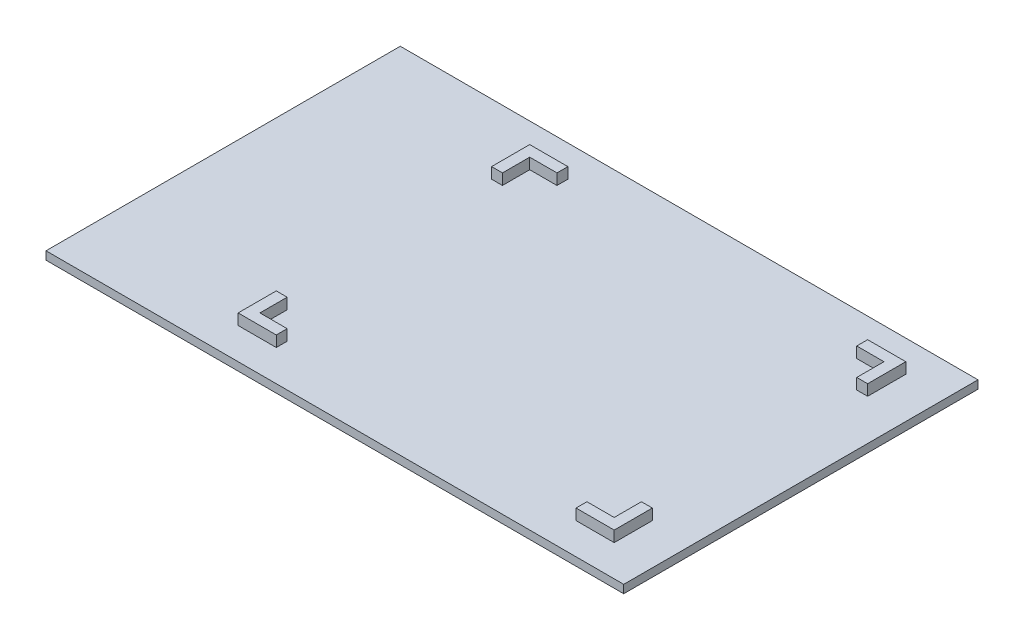
ISO-10303-21;
HEADER;
FILE_DESCRIPTION(('STEP AP214'),'2;1');
FILE_NAME('part.step','',(''),(''),'','','');
FILE_SCHEMA(('AUTOMOTIVE_DESIGN { 1 0 10303 214 1 1 1 1 }'));
ENDSEC;
DATA;
#1=APPLICATION_CONTEXT('core data for automotive mechanical design processes');
#2=APPLICATION_PROTOCOL_DEFINITION('international standard','automotive_design',2000,#1);
#3=PRODUCT_CONTEXT('',#1,'mechanical');
#4=PRODUCT('Part','Part','',(#3));
#5=PRODUCT_RELATED_PRODUCT_CATEGORY('part','',(#4));
#6=PRODUCT_DEFINITION_FORMATION('','',#4);
#7=PRODUCT_DEFINITION_CONTEXT('part definition',#1,'design');
#8=PRODUCT_DEFINITION('design','',#6,#7);
#9=PRODUCT_DEFINITION_SHAPE('','',#8);
#10=(LENGTH_UNIT() NAMED_UNIT(*) SI_UNIT(.MILLI.,.METRE.));
#11=(NAMED_UNIT(*) PLANE_ANGLE_UNIT() SI_UNIT($,.RADIAN.));
#12=(NAMED_UNIT(*) SI_UNIT($,.STERADIAN.) SOLID_ANGLE_UNIT());
#13=UNCERTAINTY_MEASURE_WITH_UNIT(LENGTH_MEASURE(1.E-05),#10,'distance_accuracy_value','');
#14=(GEOMETRIC_REPRESENTATION_CONTEXT(3) GLOBAL_UNCERTAINTY_ASSIGNED_CONTEXT((#13)) GLOBAL_UNIT_ASSIGNED_CONTEXT((#10,
#11,#12)) REPRESENTATION_CONTEXT('',''));
#15=CARTESIAN_POINT('',(0.,0.,0.));
#16=DIRECTION('',(0.,0.,1.));
#17=DIRECTION('',(1.,0.,0.));
#18=AXIS2_PLACEMENT_3D('',#15,#16,#17);
#19=CARTESIAN_POINT('',(0.,3.,0.));
#20=DIRECTION('',(0.,1.,0.));
#21=DIRECTION('',(0.,0.,1.));
#22=AXIS2_PLACEMENT_3D('',#19,#20,#21);
#23=PLANE('',#22);
#24=DIRECTION('',(-1.,0.,0.));
#25=VECTOR('',#24,1.);
#26=CARTESIAN_POINT('',(106.,3.,-65.));
#27=LINE('',#26,#25);
#28=CARTESIAN_POINT('',(106.,3.,-65.));
#29=VERTEX_POINT('',#28);
#30=CARTESIAN_POINT('',(-106.,3.,-65.));
#31=VERTEX_POINT('',#30);
#32=EDGE_CURVE('E466',#29,#31,#27,.T.);
#33=ORIENTED_EDGE('',*,*,#32,.T.);
#34=DIRECTION('',(0.,0.,1.));
#35=VECTOR('',#34,1.);
#36=CARTESIAN_POINT('',(-106.,3.,-65.));
#37=LINE('',#36,#35);
#38=CARTESIAN_POINT('',(-106.,3.,65.));
#39=VERTEX_POINT('',#38);
#40=EDGE_CURVE('E470',#31,#39,#37,.T.);
#41=ORIENTED_EDGE('',*,*,#40,.T.);
#42=DIRECTION('',(1.,0.,0.));
#43=VECTOR('',#42,1.);
#44=CARTESIAN_POINT('',(-106.,3.,65.));
#45=LINE('',#44,#43);
#46=CARTESIAN_POINT('',(106.,3.,65.));
#47=VERTEX_POINT('',#46);
#48=EDGE_CURVE('E474',#39,#47,#45,.T.);
#49=ORIENTED_EDGE('',*,*,#48,.T.);
#50=DIRECTION('',(0.,0.,-1.));
#51=VECTOR('',#50,1.);
#52=CARTESIAN_POINT('',(106.,3.,65.));
#53=LINE('',#52,#51);
#54=EDGE_CURVE('E477',#47,#29,#53,.T.);
#55=ORIENTED_EDGE('',*,*,#54,.T.);
#56=EDGE_LOOP('',(#33,#41,#49,#55));
#57=FACE_BOUND('',#56,.T.);
#58=DIRECTION('',(-1.,0.,0.));
#59=VECTOR('',#58,1.);
#60=CARTESIAN_POINT('',(91.,3.,-53.5));
#61=LINE('',#60,#59);
#62=CARTESIAN_POINT('',(91.,3.,-53.5));
#63=VERTEX_POINT('',#62);
#64=CARTESIAN_POINT('',(77.,3.,-53.5));
#65=VERTEX_POINT('',#64);
#66=EDGE_CURVE('E268',#63,#65,#61,.T.);
#67=ORIENTED_EDGE('',*,*,#66,.F.);
#68=DIRECTION('',(0.,0.,-1.));
#69=VECTOR('',#68,1.);
#70=CARTESIAN_POINT('',(91.,3.,-39.5));
#71=LINE('',#70,#69);
#72=CARTESIAN_POINT('',(91.,3.,-39.5));
#73=VERTEX_POINT('',#72);
#74=EDGE_CURVE('E263',#73,#63,#71,.T.);
#75=ORIENTED_EDGE('',*,*,#74,.F.);
#76=DIRECTION('',(1.,0.,0.));
#77=VECTOR('',#76,1.);
#78=CARTESIAN_POINT('',(87.,3.,-39.5));
#79=LINE('',#78,#77);
#80=CARTESIAN_POINT('',(87.,3.,-39.5));
#81=VERTEX_POINT('',#80);
#82=EDGE_CURVE('E414',#81,#73,#79,.T.);
#83=ORIENTED_EDGE('',*,*,#82,.F.);
#84=DIRECTION('',(0.,0.,1.));
#85=VECTOR('',#84,1.);
#86=CARTESIAN_POINT('',(87.,3.,-49.5));
#87=LINE('',#86,#85);
#88=CARTESIAN_POINT('',(87.,3.,-49.5));
#89=VERTEX_POINT('',#88);
#90=EDGE_CURVE('E438',#89,#81,#87,.T.);
#91=ORIENTED_EDGE('',*,*,#90,.F.);
#92=DIRECTION('',(1.,0.,0.));
#93=VECTOR('',#92,1.);
#94=CARTESIAN_POINT('',(77.,3.,-49.5));
#95=LINE('',#94,#93);
#96=CARTESIAN_POINT('',(77.,3.,-49.5));
#97=VERTEX_POINT('',#96);
#98=EDGE_CURVE('E435',#97,#89,#95,.T.);
#99=ORIENTED_EDGE('',*,*,#98,.F.);
#100=DIRECTION('',(0.,0.,1.));
#101=VECTOR('',#100,1.);
#102=CARTESIAN_POINT('',(77.,3.,-53.5));
#103=LINE('',#102,#101);
#104=EDGE_CURVE('E432',#65,#97,#103,.T.);
#105=ORIENTED_EDGE('',*,*,#104,.F.);
#106=EDGE_LOOP('',(#67,#75,#83,#91,#99,#105));
#107=FACE_BOUND('',#106,.T.);
#108=DIRECTION('',(0.,0.,1.));
#109=VECTOR('',#108,1.);
#110=CARTESIAN_POINT('',(87.,3.,49.5));
#111=LINE('',#110,#109);
#112=CARTESIAN_POINT('',(87.,3.,39.5));
#113=VERTEX_POINT('',#112);
#114=CARTESIAN_POINT('',(87.,3.,49.5));
#115=VERTEX_POINT('',#114);
#116=EDGE_CURVE('E261',#113,#115,#111,.T.);
#117=ORIENTED_EDGE('',*,*,#116,.F.);
#118=DIRECTION('',(-1.,0.,0.));
#119=VECTOR('',#118,1.);
#120=CARTESIAN_POINT('',(87.,3.,39.5));
#121=LINE('',#120,#119);
#122=CARTESIAN_POINT('',(91.,3.,39.5));
#123=VERTEX_POINT('',#122);
#124=EDGE_CURVE('E253',#123,#113,#121,.T.);
#125=ORIENTED_EDGE('',*,*,#124,.F.);
#126=DIRECTION('',(0.,0.,-1.));
#127=VECTOR('',#126,1.);
#128=CARTESIAN_POINT('',(91.,3.,39.5));
#129=LINE('',#128,#127);
#130=CARTESIAN_POINT('',(91.,3.,53.5));
#131=VERTEX_POINT('',#130);
#132=EDGE_CURVE('E233',#131,#123,#129,.T.);
#133=ORIENTED_EDGE('',*,*,#132,.F.);
#134=DIRECTION('',(1.,0.,0.));
#135=VECTOR('',#134,1.);
#136=CARTESIAN_POINT('',(91.,3.,53.5));
#137=LINE('',#136,#135);
#138=CARTESIAN_POINT('',(77.,3.,53.5));
#139=VERTEX_POINT('',#138);
#140=EDGE_CURVE('E246',#139,#131,#137,.T.);
#141=ORIENTED_EDGE('',*,*,#140,.F.);
#142=DIRECTION('',(0.,0.,1.));
#143=VECTOR('',#142,1.);
#144=CARTESIAN_POINT('',(77.,3.,53.5));
#145=LINE('',#144,#143);
#146=CARTESIAN_POINT('',(77.,3.,49.5));
#147=VERTEX_POINT('',#146);
#148=EDGE_CURVE('E877',#147,#139,#145,.T.);
#149=ORIENTED_EDGE('',*,*,#148,.F.);
#150=DIRECTION('',(-1.,0.,0.));
#151=VECTOR('',#150,1.);
#152=CARTESIAN_POINT('',(77.,3.,49.5));
#153=LINE('',#152,#151);
#154=EDGE_CURVE('E270',#115,#147,#153,.T.);
#155=ORIENTED_EDGE('',*,*,#154,.F.);
#156=EDGE_LOOP('',(#117,#125,#133,#141,#149,#155));
#157=FACE_BOUND('',#156,.T.);
#158=DIRECTION('',(0.,0.,-1.));
#159=VECTOR('',#158,1.);
#160=CARTESIAN_POINT('',(-43.,3.,49.5));
#161=LINE('',#160,#159);
#162=CARTESIAN_POINT('',(-43.,3.,49.5));
#163=VERTEX_POINT('',#162);
#164=CARTESIAN_POINT('',(-43.,3.,39.5));
#165=VERTEX_POINT('',#164);
#166=EDGE_CURVE('E326',#163,#165,#161,.T.);
#167=ORIENTED_EDGE('',*,*,#166,.F.);
#168=DIRECTION('',(-1.,0.,0.));
#169=VECTOR('',#168,1.);
#170=CARTESIAN_POINT('',(-33.,3.,49.5));
#171=LINE('',#170,#169);
#172=CARTESIAN_POINT('',(-33.,3.,49.5));
#173=VERTEX_POINT('',#172);
#174=EDGE_CURVE('E329',#173,#163,#171,.T.);
#175=ORIENTED_EDGE('',*,*,#174,.F.);
#176=DIRECTION('',(0.,0.,-1.));
#177=VECTOR('',#176,1.);
#178=CARTESIAN_POINT('',(-33.,3.,53.5));
#179=LINE('',#178,#177);
#180=CARTESIAN_POINT('',(-33.,3.,53.5));
#181=VERTEX_POINT('',#180);
#182=EDGE_CURVE('E313',#181,#173,#179,.T.);
#183=ORIENTED_EDGE('',*,*,#182,.F.);
#184=DIRECTION('',(1.,0.,0.));
#185=VECTOR('',#184,1.);
#186=CARTESIAN_POINT('',(-47.,3.,53.5));
#187=LINE('',#186,#185);
#188=CARTESIAN_POINT('',(-47.,3.,53.5));
#189=VERTEX_POINT('',#188);
#190=EDGE_CURVE('E316',#189,#181,#187,.T.);
#191=ORIENTED_EDGE('',*,*,#190,.F.);
#192=DIRECTION('',(0.,0.,1.));
#193=VECTOR('',#192,1.);
#194=CARTESIAN_POINT('',(-47.,3.,39.5));
#195=LINE('',#194,#193);
#196=CARTESIAN_POINT('',(-47.,3.,39.5));
#197=VERTEX_POINT('',#196);
#198=EDGE_CURVE('E320',#197,#189,#195,.T.);
#199=ORIENTED_EDGE('',*,*,#198,.F.);
#200=DIRECTION('',(-1.,0.,0.));
#201=VECTOR('',#200,1.);
#202=CARTESIAN_POINT('',(-43.,3.,39.5));
#203=LINE('',#202,#201);
#204=EDGE_CURVE('E323',#165,#197,#203,.T.);
#205=ORIENTED_EDGE('',*,*,#204,.F.);
#206=EDGE_LOOP('',(#167,#175,#183,#191,#199,#205));
#207=FACE_BOUND('',#206,.T.);
#208=DIRECTION('',(1.,0.,0.));
#209=VECTOR('',#208,1.);
#210=CARTESIAN_POINT('',(-33.,3.,-49.5));
#211=LINE('',#210,#209);
#212=CARTESIAN_POINT('',(-43.,3.,-49.5));
#213=VERTEX_POINT('',#212);
#214=CARTESIAN_POINT('',(-33.,3.,-49.5));
#215=VERTEX_POINT('',#214);
#216=EDGE_CURVE('E386',#213,#215,#211,.T.);
#217=ORIENTED_EDGE('',*,*,#216,.F.);
#218=DIRECTION('',(0.,0.,-1.));
#219=VECTOR('',#218,1.);
#220=CARTESIAN_POINT('',(-43.,3.,-49.5));
#221=LINE('',#220,#219);
#222=CARTESIAN_POINT('',(-43.,3.,-39.5));
#223=VERTEX_POINT('',#222);
#224=EDGE_CURVE('E294',#223,#213,#221,.T.);
#225=ORIENTED_EDGE('',*,*,#224,.F.);
#226=DIRECTION('',(1.,0.,0.));
#227=VECTOR('',#226,1.);
#228=CARTESIAN_POINT('',(-43.,3.,-39.5));
#229=LINE('',#228,#227);
#230=CARTESIAN_POINT('',(-47.,3.,-39.5));
#231=VERTEX_POINT('',#230);
#232=EDGE_CURVE('E373',#231,#223,#229,.T.);
#233=ORIENTED_EDGE('',*,*,#232,.F.);
#234=DIRECTION('',(0.,0.,1.));
#235=VECTOR('',#234,1.);
#236=CARTESIAN_POINT('',(-47.,3.,-39.5));
#237=LINE('',#236,#235);
#238=CARTESIAN_POINT('',(-47.,3.,-53.5));
#239=VERTEX_POINT('',#238);
#240=EDGE_CURVE('E376',#239,#231,#237,.T.);
#241=ORIENTED_EDGE('',*,*,#240,.F.);
#242=DIRECTION('',(-1.,0.,0.));
#243=VECTOR('',#242,1.);
#244=CARTESIAN_POINT('',(-47.,3.,-53.5));
#245=LINE('',#244,#243);
#246=CARTESIAN_POINT('',(-33.,3.,-53.5));
#247=VERTEX_POINT('',#246);
#248=EDGE_CURVE('E380',#247,#239,#245,.T.);
#249=ORIENTED_EDGE('',*,*,#248,.F.);
#250=DIRECTION('',(0.,0.,-1.));
#251=VECTOR('',#250,1.);
#252=CARTESIAN_POINT('',(-33.,3.,-53.5));
#253=LINE('',#252,#251);
#254=EDGE_CURVE('E383',#215,#247,#253,.T.);
#255=ORIENTED_EDGE('',*,*,#254,.F.);
#256=EDGE_LOOP('',(#217,#225,#233,#241,#249,#255));
#257=FACE_BOUND('',#256,.T.);
#258=ADVANCED_FACE('F45',(#57,#107,#157,#207,#257),#23,.T.);
#259=CARTESIAN_POINT('',(106.,3.,-65.));
#260=DIRECTION('',(0.,0.,1.));
#261=DIRECTION('',(1.,0.,0.));
#262=AXIS2_PLACEMENT_3D('',#259,#260,#261);
#263=PLANE('',#262);
#264=DIRECTION('',(-1.,0.,0.));
#265=VECTOR('',#264,1.);
#266=CARTESIAN_POINT('',(106.,0.,-65.));
#267=LINE('',#266,#265);
#268=CARTESIAN_POINT('',(106.,0.,-65.));
#269=VERTEX_POINT('',#268);
#270=CARTESIAN_POINT('',(-106.,0.,-65.));
#271=VERTEX_POINT('',#270);
#272=EDGE_CURVE('E465',#269,#271,#267,.T.);
#273=ORIENTED_EDGE('',*,*,#272,.T.);
#274=DIRECTION('',(0.,-1.,0.));
#275=VECTOR('',#274,1.);
#276=CARTESIAN_POINT('',(-106.,3.,-65.));
#277=LINE('',#276,#275);
#278=EDGE_CURVE('E11',#31,#271,#277,.T.);
#279=ORIENTED_EDGE('',*,*,#278,.F.);
#280=ORIENTED_EDGE('',*,*,#32,.F.);
#281=DIRECTION('',(0.,-1.,0.));
#282=VECTOR('',#281,1.);
#283=CARTESIAN_POINT('',(106.,3.,-65.));
#284=LINE('',#283,#282);
#285=EDGE_CURVE('E480',#29,#269,#284,.T.);
#286=ORIENTED_EDGE('',*,*,#285,.T.);
#287=EDGE_LOOP('',(#273,#279,#280,#286));
#288=FACE_BOUND('',#287,.T.);
#289=ADVANCED_FACE('F47',(#288),#263,.F.);
#290=CARTESIAN_POINT('',(-106.,3.,-65.));
#291=DIRECTION('',(1.,0.,0.));
#292=DIRECTION('',(0.,0.,-1.));
#293=AXIS2_PLACEMENT_3D('',#290,#291,#292);
#294=PLANE('',#293);
#295=DIRECTION('',(0.,0.,1.));
#296=VECTOR('',#295,1.);
#297=CARTESIAN_POINT('',(-106.,0.,-65.));
#298=LINE('',#297,#296);
#299=CARTESIAN_POINT('',(-106.,0.,65.));
#300=VERTEX_POINT('',#299);
#301=EDGE_CURVE('E484',#271,#300,#298,.T.);
#302=ORIENTED_EDGE('',*,*,#301,.T.);
#303=DIRECTION('',(0.,-1.,0.));
#304=VECTOR('',#303,1.);
#305=CARTESIAN_POINT('',(-106.,3.,65.));
#306=LINE('',#305,#304);
#307=EDGE_CURVE('E54',#39,#300,#306,.T.);
#308=ORIENTED_EDGE('',*,*,#307,.F.);
#309=ORIENTED_EDGE('',*,*,#40,.F.);
#310=ORIENTED_EDGE('',*,*,#278,.T.);
#311=EDGE_LOOP('',(#302,#308,#309,#310));
#312=FACE_BOUND('',#311,.T.);
#313=ADVANCED_FACE('F520',(#312),#294,.F.);
#314=CARTESIAN_POINT('',(-106.,3.,65.));
#315=DIRECTION('',(0.,0.,-1.));
#316=DIRECTION('',(-1.,0.,0.));
#317=AXIS2_PLACEMENT_3D('',#314,#315,#316);
#318=PLANE('',#317);
#319=DIRECTION('',(1.,0.,0.));
#320=VECTOR('',#319,1.);
#321=CARTESIAN_POINT('',(-106.,0.,65.));
#322=LINE('',#321,#320);
#323=CARTESIAN_POINT('',(106.,0.,65.));
#324=VERTEX_POINT('',#323);
#325=EDGE_CURVE('E487',#300,#324,#322,.T.);
#326=ORIENTED_EDGE('',*,*,#325,.T.);
#327=DIRECTION('',(0.,-1.,0.));
#328=VECTOR('',#327,1.);
#329=CARTESIAN_POINT('',(106.,3.,65.));
#330=LINE('',#329,#328);
#331=EDGE_CURVE('E495',#47,#324,#330,.T.);
#332=ORIENTED_EDGE('',*,*,#331,.F.);
#333=ORIENTED_EDGE('',*,*,#48,.F.);
#334=ORIENTED_EDGE('',*,*,#307,.T.);
#335=EDGE_LOOP('',(#326,#332,#333,#334));
#336=FACE_BOUND('',#335,.T.);
#337=ADVANCED_FACE('F504',(#336),#318,.F.);
#338=CARTESIAN_POINT('',(106.,3.,65.));
#339=DIRECTION('',(-1.,0.,0.));
#340=DIRECTION('',(0.,0.,1.));
#341=AXIS2_PLACEMENT_3D('',#338,#339,#340);
#342=PLANE('',#341);
#343=DIRECTION('',(0.,0.,-1.));
#344=VECTOR('',#343,1.);
#345=CARTESIAN_POINT('',(106.,0.,65.));
#346=LINE('',#345,#344);
#347=EDGE_CURVE('E471',#324,#269,#346,.T.);
#348=ORIENTED_EDGE('',*,*,#347,.T.);
#349=ORIENTED_EDGE('',*,*,#285,.F.);
#350=ORIENTED_EDGE('',*,*,#54,.F.);
#351=ORIENTED_EDGE('',*,*,#331,.T.);
#352=EDGE_LOOP('',(#348,#349,#350,#351));
#353=FACE_BOUND('',#352,.T.);
#354=ADVANCED_FACE('F513',(#353),#342,.F.);
#355=CARTESIAN_POINT('',(0.,0.,0.));
#356=DIRECTION('',(0.,1.,0.));
#357=DIRECTION('',(0.,0.,1.));
#358=AXIS2_PLACEMENT_3D('',#355,#356,#357);
#359=PLANE('',#358);
#360=ORIENTED_EDGE('',*,*,#272,.F.);
#361=ORIENTED_EDGE('',*,*,#347,.F.);
#362=ORIENTED_EDGE('',*,*,#325,.F.);
#363=ORIENTED_EDGE('',*,*,#301,.F.);
#364=EDGE_LOOP('',(#360,#361,#362,#363));
#365=FACE_BOUND('',#364,.T.);
#366=ADVANCED_FACE('F510',(#365),#359,.F.);
#367=CARTESIAN_POINT('',(91.,7.,-39.5));
#368=DIRECTION('',(-1.,0.,0.));
#369=DIRECTION('',(0.,0.,1.));
#370=AXIS2_PLACEMENT_3D('',#367,#368,#369);
#371=PLANE('',#370);
#372=ORIENTED_EDGE('',*,*,#74,.T.);
#373=DIRECTION('',(0.,-1.,0.));
#374=VECTOR('',#373,1.);
#375=CARTESIAN_POINT('',(91.,7.,-53.5));
#376=LINE('',#375,#374);
#377=CARTESIAN_POINT('',(91.,7.,-53.5));
#378=VERTEX_POINT('',#377);
#379=EDGE_CURVE('E462',#378,#63,#376,.T.);
#380=ORIENTED_EDGE('',*,*,#379,.F.);
#381=DIRECTION('',(0.,0.,-1.));
#382=VECTOR('',#381,1.);
#383=CARTESIAN_POINT('',(91.,7.,-39.5));
#384=LINE('',#383,#382);
#385=CARTESIAN_POINT('',(91.,7.,-39.5));
#386=VERTEX_POINT('',#385);
#387=EDGE_CURVE('E409',#386,#378,#384,.T.);
#388=ORIENTED_EDGE('',*,*,#387,.F.);
#389=DIRECTION('',(0.,-1.,0.));
#390=VECTOR('',#389,1.);
#391=CARTESIAN_POINT('',(91.,7.,-39.5));
#392=LINE('',#391,#390);
#393=EDGE_CURVE('E428',#386,#73,#392,.T.);
#394=ORIENTED_EDGE('',*,*,#393,.T.);
#395=EDGE_LOOP('',(#372,#380,#388,#394));
#396=FACE_BOUND('',#395,.T.);
#397=ADVANCED_FACE('F535',(#396),#371,.F.);
#398=CARTESIAN_POINT('',(91.,7.,-53.5));
#399=DIRECTION('',(0.,0.,1.));
#400=DIRECTION('',(1.,0.,0.));
#401=AXIS2_PLACEMENT_3D('',#398,#399,#400);
#402=PLANE('',#401);
#403=ORIENTED_EDGE('',*,*,#66,.T.);
#404=DIRECTION('',(0.,-1.,0.));
#405=VECTOR('',#404,1.);
#406=CARTESIAN_POINT('',(77.,7.,-53.5));
#407=LINE('',#406,#405);
#408=CARTESIAN_POINT('',(77.,7.,-53.5));
#409=VERTEX_POINT('',#408);
#410=EDGE_CURVE('E458',#409,#65,#407,.T.);
#411=ORIENTED_EDGE('',*,*,#410,.F.);
#412=DIRECTION('',(-1.,0.,0.));
#413=VECTOR('',#412,1.);
#414=CARTESIAN_POINT('',(91.,7.,-53.5));
#415=LINE('',#414,#413);
#416=EDGE_CURVE('E413',#378,#409,#415,.T.);
#417=ORIENTED_EDGE('',*,*,#416,.F.);
#418=ORIENTED_EDGE('',*,*,#379,.T.);
#419=EDGE_LOOP('',(#403,#411,#417,#418));
#420=FACE_BOUND('',#419,.T.);
#421=ADVANCED_FACE('F561',(#420),#402,.F.);
#422=CARTESIAN_POINT('',(77.,7.,-53.5));
#423=DIRECTION('',(1.,0.,0.));
#424=DIRECTION('',(0.,0.,-1.));
#425=AXIS2_PLACEMENT_3D('',#422,#423,#424);
#426=PLANE('',#425);
#427=ORIENTED_EDGE('',*,*,#104,.T.);
#428=DIRECTION('',(0.,-1.,0.));
#429=VECTOR('',#428,1.);
#430=CARTESIAN_POINT('',(77.,7.,-49.5));
#431=LINE('',#430,#429);
#432=CARTESIAN_POINT('',(77.,7.,-49.5));
#433=VERTEX_POINT('',#432);
#434=EDGE_CURVE('E454',#433,#97,#431,.T.);
#435=ORIENTED_EDGE('',*,*,#434,.F.);
#436=DIRECTION('',(0.,0.,1.));
#437=VECTOR('',#436,1.);
#438=CARTESIAN_POINT('',(77.,7.,-53.5));
#439=LINE('',#438,#437);
#440=EDGE_CURVE('E417',#409,#433,#439,.T.);
#441=ORIENTED_EDGE('',*,*,#440,.F.);
#442=ORIENTED_EDGE('',*,*,#410,.T.);
#443=EDGE_LOOP('',(#427,#435,#441,#442));
#444=FACE_BOUND('',#443,.T.);
#445=ADVANCED_FACE('F570',(#444),#426,.F.);
#446=CARTESIAN_POINT('',(77.,7.,-49.5));
#447=DIRECTION('',(0.,0.,-1.));
#448=DIRECTION('',(-1.,0.,0.));
#449=AXIS2_PLACEMENT_3D('',#446,#447,#448);
#450=PLANE('',#449);
#451=ORIENTED_EDGE('',*,*,#98,.T.);
#452=DIRECTION('',(0.,-1.,0.));
#453=VECTOR('',#452,1.);
#454=CARTESIAN_POINT('',(87.,7.,-49.5));
#455=LINE('',#454,#453);
#456=CARTESIAN_POINT('',(87.,7.,-49.5));
#457=VERTEX_POINT('',#456);
#458=EDGE_CURVE('E450',#457,#89,#455,.T.);
#459=ORIENTED_EDGE('',*,*,#458,.F.);
#460=DIRECTION('',(1.,0.,0.));
#461=VECTOR('',#460,1.);
#462=CARTESIAN_POINT('',(77.,7.,-49.5));
#463=LINE('',#462,#461);
#464=EDGE_CURVE('E420',#433,#457,#463,.T.);
#465=ORIENTED_EDGE('',*,*,#464,.F.);
#466=ORIENTED_EDGE('',*,*,#434,.T.);
#467=EDGE_LOOP('',(#451,#459,#465,#466));
#468=FACE_BOUND('',#467,.T.);
#469=ADVANCED_FACE('F579',(#468),#450,.F.);
#470=CARTESIAN_POINT('',(87.,7.,-49.5));
#471=DIRECTION('',(1.,0.,0.));
#472=DIRECTION('',(0.,0.,-1.));
#473=AXIS2_PLACEMENT_3D('',#470,#471,#472);
#474=PLANE('',#473);
#475=ORIENTED_EDGE('',*,*,#90,.T.);
#476=DIRECTION('',(0.,-1.,0.));
#477=VECTOR('',#476,1.);
#478=CARTESIAN_POINT('',(87.,7.,-39.5));
#479=LINE('',#478,#477);
#480=CARTESIAN_POINT('',(87.,7.,-39.5));
#481=VERTEX_POINT('',#480);
#482=EDGE_CURVE('E447',#481,#81,#479,.T.);
#483=ORIENTED_EDGE('',*,*,#482,.F.);
#484=DIRECTION('',(0.,0.,1.));
#485=VECTOR('',#484,1.);
#486=CARTESIAN_POINT('',(87.,7.,-49.5));
#487=LINE('',#486,#485);
#488=EDGE_CURVE('E423',#457,#481,#487,.T.);
#489=ORIENTED_EDGE('',*,*,#488,.F.);
#490=ORIENTED_EDGE('',*,*,#458,.T.);
#491=EDGE_LOOP('',(#475,#483,#489,#490));
#492=FACE_BOUND('',#491,.T.);
#493=ADVANCED_FACE('F589',(#492),#474,.F.);
#494=CARTESIAN_POINT('',(87.,7.,-39.5));
#495=DIRECTION('',(0.,0.,-1.));
#496=DIRECTION('',(-1.,0.,0.));
#497=AXIS2_PLACEMENT_3D('',#494,#495,#496);
#498=PLANE('',#497);
#499=ORIENTED_EDGE('',*,*,#82,.T.);
#500=ORIENTED_EDGE('',*,*,#393,.F.);
#501=DIRECTION('',(1.,0.,0.));
#502=VECTOR('',#501,1.);
#503=CARTESIAN_POINT('',(87.,7.,-39.5));
#504=LINE('',#503,#502);
#505=EDGE_CURVE('E426',#481,#386,#504,.T.);
#506=ORIENTED_EDGE('',*,*,#505,.F.);
#507=ORIENTED_EDGE('',*,*,#482,.T.);
#508=EDGE_LOOP('',(#499,#500,#506,#507));
#509=FACE_BOUND('',#508,.T.);
#510=ADVANCED_FACE('F599',(#509),#498,.F.);
#511=CARTESIAN_POINT('',(0.,7.,0.));
#512=DIRECTION('',(0.,1.,0.));
#513=DIRECTION('',(0.,0.,1.));
#514=AXIS2_PLACEMENT_3D('',#511,#512,#513);
#515=PLANE('',#514);
#516=ORIENTED_EDGE('',*,*,#387,.T.);
#517=ORIENTED_EDGE('',*,*,#416,.T.);
#518=ORIENTED_EDGE('',*,*,#440,.T.);
#519=ORIENTED_EDGE('',*,*,#464,.T.);
#520=ORIENTED_EDGE('',*,*,#488,.T.);
#521=ORIENTED_EDGE('',*,*,#505,.T.);
#522=EDGE_LOOP('',(#516,#517,#518,#519,#520,#521));
#523=FACE_BOUND('',#522,.T.);
#524=ADVANCED_FACE('F609',(#523),#515,.T.);
#525=CARTESIAN_POINT('',(87.,7.,39.5));
#526=DIRECTION('',(0.,0.,1.));
#527=DIRECTION('',(1.,0.,0.));
#528=AXIS2_PLACEMENT_3D('',#525,#526,#527);
#529=PLANE('',#528);
#530=ORIENTED_EDGE('',*,*,#124,.T.);
#531=DIRECTION('',(0.,-1.,0.));
#532=VECTOR('',#531,1.);
#533=CARTESIAN_POINT('',(87.,7.,39.5));
#534=LINE('',#533,#532);
#535=CARTESIAN_POINT('',(87.,7.,39.5));
#536=VERTEX_POINT('',#535);
#537=EDGE_CURVE('E333',#536,#113,#534,.T.);
#538=ORIENTED_EDGE('',*,*,#537,.F.);
#539=DIRECTION('',(-1.,0.,0.));
#540=VECTOR('',#539,1.);
#541=CARTESIAN_POINT('',(87.,7.,39.5));
#542=LINE('',#541,#540);
#543=CARTESIAN_POINT('',(91.,7.,39.5));
#544=VERTEX_POINT('',#543);
#545=EDGE_CURVE('E247',#544,#536,#542,.T.);
#546=ORIENTED_EDGE('',*,*,#545,.F.);
#547=DIRECTION('',(0.,-1.,0.));
#548=VECTOR('',#547,1.);
#549=CARTESIAN_POINT('',(91.,7.,39.5));
#550=LINE('',#549,#548);
#551=EDGE_CURVE('E237',#544,#123,#550,.T.);
#552=ORIENTED_EDGE('',*,*,#551,.T.);
#553=EDGE_LOOP('',(#530,#538,#546,#552));
#554=FACE_BOUND('',#553,.T.);
#555=ADVANCED_FACE('F251',(#554),#529,.F.);
#556=CARTESIAN_POINT('',(87.,7.,49.5));
#557=DIRECTION('',(1.,0.,0.));
#558=DIRECTION('',(0.,0.,-1.));
#559=AXIS2_PLACEMENT_3D('',#556,#557,#558);
#560=PLANE('',#559);
#561=ORIENTED_EDGE('',*,*,#116,.T.);
#562=DIRECTION('',(0.,-1.,0.));
#563=VECTOR('',#562,1.);
#564=CARTESIAN_POINT('',(87.,7.,49.5));
#565=LINE('',#564,#563);
#566=CARTESIAN_POINT('',(87.,7.,49.5));
#567=VERTEX_POINT('',#566);
#568=EDGE_CURVE('E859',#567,#115,#565,.T.);
#569=ORIENTED_EDGE('',*,*,#568,.F.);
#570=DIRECTION('',(0.,0.,1.));
#571=VECTOR('',#570,1.);
#572=CARTESIAN_POINT('',(87.,7.,49.5));
#573=LINE('',#572,#571);
#574=EDGE_CURVE('E285',#536,#567,#573,.T.);
#575=ORIENTED_EDGE('',*,*,#574,.F.);
#576=ORIENTED_EDGE('',*,*,#537,.T.);
#577=EDGE_LOOP('',(#561,#569,#575,#576));
#578=FACE_BOUND('',#577,.T.);
#579=ADVANCED_FACE('F628',(#578),#560,.F.);
#580=CARTESIAN_POINT('',(77.,7.,49.5));
#581=DIRECTION('',(0.,0.,1.));
#582=DIRECTION('',(1.,0.,0.));
#583=AXIS2_PLACEMENT_3D('',#580,#581,#582);
#584=PLANE('',#583);
#585=ORIENTED_EDGE('',*,*,#154,.T.);
#586=DIRECTION('',(0.,-1.,0.));
#587=VECTOR('',#586,1.);
#588=CARTESIAN_POINT('',(77.,7.,49.5));
#589=LINE('',#588,#587);
#590=CARTESIAN_POINT('',(77.,7.,49.5));
#591=VERTEX_POINT('',#590);
#592=EDGE_CURVE('E863',#591,#147,#589,.T.);
#593=ORIENTED_EDGE('',*,*,#592,.F.);
#594=DIRECTION('',(-1.,0.,0.));
#595=VECTOR('',#594,1.);
#596=CARTESIAN_POINT('',(77.,7.,49.5));
#597=LINE('',#596,#595);
#598=EDGE_CURVE('E282',#567,#591,#597,.T.);
#599=ORIENTED_EDGE('',*,*,#598,.F.);
#600=ORIENTED_EDGE('',*,*,#568,.T.);
#601=EDGE_LOOP('',(#585,#593,#599,#600));
#602=FACE_BOUND('',#601,.T.);
#603=ADVANCED_FACE('F637',(#602),#584,.F.);
#604=CARTESIAN_POINT('',(77.,7.,53.5));
#605=DIRECTION('',(1.,0.,0.));
#606=DIRECTION('',(0.,0.,-1.));
#607=AXIS2_PLACEMENT_3D('',#604,#605,#606);
#608=PLANE('',#607);
#609=ORIENTED_EDGE('',*,*,#148,.T.);
#610=DIRECTION('',(0.,-1.,0.));
#611=VECTOR('',#610,1.);
#612=CARTESIAN_POINT('',(77.,7.,53.5));
#613=LINE('',#612,#611);
#614=CARTESIAN_POINT('',(77.,7.,53.5));
#615=VERTEX_POINT('',#614);
#616=EDGE_CURVE('E869',#615,#139,#613,.T.);
#617=ORIENTED_EDGE('',*,*,#616,.F.);
#618=DIRECTION('',(0.,0.,1.));
#619=VECTOR('',#618,1.);
#620=CARTESIAN_POINT('',(77.,7.,53.5));
#621=LINE('',#620,#619);
#622=EDGE_CURVE('E279',#591,#615,#621,.T.);
#623=ORIENTED_EDGE('',*,*,#622,.F.);
#624=ORIENTED_EDGE('',*,*,#592,.T.);
#625=EDGE_LOOP('',(#609,#617,#623,#624));
#626=FACE_BOUND('',#625,.T.);
#627=ADVANCED_FACE('F647',(#626),#608,.F.);
#628=CARTESIAN_POINT('',(91.,7.,53.5));
#629=DIRECTION('',(0.,0.,-1.));
#630=DIRECTION('',(-1.,0.,0.));
#631=AXIS2_PLACEMENT_3D('',#628,#629,#630);
#632=PLANE('',#631);
#633=ORIENTED_EDGE('',*,*,#140,.T.);
#634=DIRECTION('',(0.,-1.,0.));
#635=VECTOR('',#634,1.);
#636=CARTESIAN_POINT('',(91.,7.,53.5));
#637=LINE('',#636,#635);
#638=CARTESIAN_POINT('',(91.,7.,53.5));
#639=VERTEX_POINT('',#638);
#640=EDGE_CURVE('E240',#639,#131,#637,.T.);
#641=ORIENTED_EDGE('',*,*,#640,.F.);
#642=DIRECTION('',(1.,0.,0.));
#643=VECTOR('',#642,1.);
#644=CARTESIAN_POINT('',(91.,7.,53.5));
#645=LINE('',#644,#643);
#646=EDGE_CURVE('E276',#615,#639,#645,.T.);
#647=ORIENTED_EDGE('',*,*,#646,.F.);
#648=ORIENTED_EDGE('',*,*,#616,.T.);
#649=EDGE_LOOP('',(#633,#641,#647,#648));
#650=FACE_BOUND('',#649,.T.);
#651=ADVANCED_FACE('F657',(#650),#632,.F.);
#652=CARTESIAN_POINT('',(91.,7.,39.5));
#653=DIRECTION('',(-1.,0.,0.));
#654=DIRECTION('',(0.,0.,1.));
#655=AXIS2_PLACEMENT_3D('',#652,#653,#654);
#656=PLANE('',#655);
#657=ORIENTED_EDGE('',*,*,#132,.T.);
#658=ORIENTED_EDGE('',*,*,#551,.F.);
#659=DIRECTION('',(0.,0.,-1.));
#660=VECTOR('',#659,1.);
#661=CARTESIAN_POINT('',(91.,7.,39.5));
#662=LINE('',#661,#660);
#663=EDGE_CURVE('E257',#639,#544,#662,.T.);
#664=ORIENTED_EDGE('',*,*,#663,.F.);
#665=ORIENTED_EDGE('',*,*,#640,.T.);
#666=EDGE_LOOP('',(#657,#658,#664,#665));
#667=FACE_BOUND('',#666,.T.);
#668=ADVANCED_FACE('F235',(#667),#656,.F.);
#669=CARTESIAN_POINT('',(0.,7.,0.));
#670=DIRECTION('',(0.,-1.,0.));
#671=DIRECTION('',(0.,0.,-1.));
#672=AXIS2_PLACEMENT_3D('',#669,#670,#671);
#673=PLANE('',#672);
#674=ORIENTED_EDGE('',*,*,#545,.T.);
#675=ORIENTED_EDGE('',*,*,#574,.T.);
#676=ORIENTED_EDGE('',*,*,#598,.T.);
#677=ORIENTED_EDGE('',*,*,#622,.T.);
#678=ORIENTED_EDGE('',*,*,#646,.T.);
#679=ORIENTED_EDGE('',*,*,#663,.T.);
#680=EDGE_LOOP('',(#674,#675,#676,#677,#678,#679));
#681=FACE_BOUND('',#680,.T.);
#682=ADVANCED_FACE('F676',(#681),#673,.F.);
#683=CARTESIAN_POINT('',(-33.,7.,49.5));
#684=DIRECTION('',(0.,0.,1.));
#685=DIRECTION('',(1.,0.,0.));
#686=AXIS2_PLACEMENT_3D('',#683,#684,#685);
#687=PLANE('',#686);
#688=ORIENTED_EDGE('',*,*,#174,.T.);
#689=DIRECTION('',(0.,-1.,0.));
#690=VECTOR('',#689,1.);
#691=CARTESIAN_POINT('',(-43.,7.,49.5));
#692=LINE('',#691,#690);
#693=CARTESIAN_POINT('',(-43.,7.,49.5));
#694=VERTEX_POINT('',#693);
#695=EDGE_CURVE('E290',#694,#163,#692,.T.);
#696=ORIENTED_EDGE('',*,*,#695,.F.);
#697=DIRECTION('',(-1.,0.,0.));
#698=VECTOR('',#697,1.);
#699=CARTESIAN_POINT('',(-33.,7.,49.5));
#700=LINE('',#699,#698);
#701=CARTESIAN_POINT('',(-33.,7.,49.5));
#702=VERTEX_POINT('',#701);
#703=EDGE_CURVE('E317',#702,#694,#700,.T.);
#704=ORIENTED_EDGE('',*,*,#703,.F.);
#705=DIRECTION('',(0.,-1.,0.));
#706=VECTOR('',#705,1.);
#707=CARTESIAN_POINT('',(-33.,7.,49.5));
#708=LINE('',#707,#706);
#709=EDGE_CURVE('E308',#702,#173,#708,.T.);
#710=ORIENTED_EDGE('',*,*,#709,.T.);
#711=EDGE_LOOP('',(#688,#696,#704,#710));
#712=FACE_BOUND('',#711,.T.);
#713=ADVANCED_FACE('F685',(#712),#687,.F.);
#714=CARTESIAN_POINT('',(-43.,7.,49.5));
#715=DIRECTION('',(-1.,0.,0.));
#716=DIRECTION('',(0.,0.,1.));
#717=AXIS2_PLACEMENT_3D('',#714,#715,#716);
#718=PLANE('',#717);
#719=ORIENTED_EDGE('',*,*,#166,.T.);
#720=DIRECTION('',(0.,-1.,0.));
#721=VECTOR('',#720,1.);
#722=CARTESIAN_POINT('',(-43.,7.,39.5));
#723=LINE('',#722,#721);
#724=CARTESIAN_POINT('',(-43.,7.,39.5));
#725=VERTEX_POINT('',#724);
#726=EDGE_CURVE('E293',#725,#165,#723,.T.);
#727=ORIENTED_EDGE('',*,*,#726,.F.);
#728=DIRECTION('',(0.,0.,-1.));
#729=VECTOR('',#728,1.);
#730=CARTESIAN_POINT('',(-43.,7.,49.5));
#731=LINE('',#730,#729);
#732=EDGE_CURVE('E345',#694,#725,#731,.T.);
#733=ORIENTED_EDGE('',*,*,#732,.F.);
#734=ORIENTED_EDGE('',*,*,#695,.T.);
#735=EDGE_LOOP('',(#719,#727,#733,#734));
#736=FACE_BOUND('',#735,.T.);
#737=ADVANCED_FACE('F695',(#736),#718,.F.);
#738=CARTESIAN_POINT('',(-43.,7.,39.5));
#739=DIRECTION('',(0.,0.,1.));
#740=DIRECTION('',(1.,0.,0.));
#741=AXIS2_PLACEMENT_3D('',#738,#739,#740);
#742=PLANE('',#741);
#743=ORIENTED_EDGE('',*,*,#204,.T.);
#744=DIRECTION('',(0.,-1.,0.));
#745=VECTOR('',#744,1.);
#746=CARTESIAN_POINT('',(-47.,7.,39.5));
#747=LINE('',#746,#745);
#748=CARTESIAN_POINT('',(-47.,7.,39.5));
#749=VERTEX_POINT('',#748);
#750=EDGE_CURVE('E298',#749,#197,#747,.T.);
#751=ORIENTED_EDGE('',*,*,#750,.F.);
#752=DIRECTION('',(-1.,0.,0.));
#753=VECTOR('',#752,1.);
#754=CARTESIAN_POINT('',(-43.,7.,39.5));
#755=LINE('',#754,#753);
#756=EDGE_CURVE('E342',#725,#749,#755,.T.);
#757=ORIENTED_EDGE('',*,*,#756,.F.);
#758=ORIENTED_EDGE('',*,*,#726,.T.);
#759=EDGE_LOOP('',(#743,#751,#757,#758));
#760=FACE_BOUND('',#759,.T.);
#761=ADVANCED_FACE('F705',(#760),#742,.F.);
#762=CARTESIAN_POINT('',(-47.,7.,39.5));
#763=DIRECTION('',(1.,0.,0.));
#764=DIRECTION('',(0.,0.,-1.));
#765=AXIS2_PLACEMENT_3D('',#762,#763,#764);
#766=PLANE('',#765);
#767=ORIENTED_EDGE('',*,*,#198,.T.);
#768=DIRECTION('',(0.,-1.,0.));
#769=VECTOR('',#768,1.);
#770=CARTESIAN_POINT('',(-47.,7.,53.5));
#771=LINE('',#770,#769);
#772=CARTESIAN_POINT('',(-47.,7.,53.5));
#773=VERTEX_POINT('',#772);
#774=EDGE_CURVE('E302',#773,#189,#771,.T.);
#775=ORIENTED_EDGE('',*,*,#774,.F.);
#776=DIRECTION('',(0.,0.,1.));
#777=VECTOR('',#776,1.);
#778=CARTESIAN_POINT('',(-47.,7.,39.5));
#779=LINE('',#778,#777);
#780=EDGE_CURVE('E339',#749,#773,#779,.T.);
#781=ORIENTED_EDGE('',*,*,#780,.F.);
#782=ORIENTED_EDGE('',*,*,#750,.T.);
#783=EDGE_LOOP('',(#767,#775,#781,#782));
#784=FACE_BOUND('',#783,.T.);
#785=ADVANCED_FACE('F715',(#784),#766,.F.);
#786=CARTESIAN_POINT('',(-47.,7.,53.5));
#787=DIRECTION('',(0.,0.,-1.));
#788=DIRECTION('',(-1.,0.,0.));
#789=AXIS2_PLACEMENT_3D('',#786,#787,#788);
#790=PLANE('',#789);
#791=ORIENTED_EDGE('',*,*,#190,.T.);
#792=DIRECTION('',(0.,-1.,0.));
#793=VECTOR('',#792,1.);
#794=CARTESIAN_POINT('',(-33.,7.,53.5));
#795=LINE('',#794,#793);
#796=CARTESIAN_POINT('',(-33.,7.,53.5));
#797=VERTEX_POINT('',#796);
#798=EDGE_CURVE('E69',#797,#181,#795,.T.);
#799=ORIENTED_EDGE('',*,*,#798,.F.);
#800=DIRECTION('',(1.,0.,0.));
#801=VECTOR('',#800,1.);
#802=CARTESIAN_POINT('',(-47.,7.,53.5));
#803=LINE('',#802,#801);
#804=EDGE_CURVE('E336',#773,#797,#803,.T.);
#805=ORIENTED_EDGE('',*,*,#804,.F.);
#806=ORIENTED_EDGE('',*,*,#774,.T.);
#807=EDGE_LOOP('',(#791,#799,#805,#806));
#808=FACE_BOUND('',#807,.T.);
#809=ADVANCED_FACE('F725',(#808),#790,.F.);
#810=CARTESIAN_POINT('',(-33.,7.,53.5));
#811=DIRECTION('',(-1.,0.,0.));
#812=DIRECTION('',(0.,0.,1.));
#813=AXIS2_PLACEMENT_3D('',#810,#811,#812);
#814=PLANE('',#813);
#815=ORIENTED_EDGE('',*,*,#182,.T.);
#816=ORIENTED_EDGE('',*,*,#709,.F.);
#817=DIRECTION('',(0.,0.,-1.));
#818=VECTOR('',#817,1.);
#819=CARTESIAN_POINT('',(-33.,7.,53.5));
#820=LINE('',#819,#818);
#821=EDGE_CURVE('E312',#797,#702,#820,.T.);
#822=ORIENTED_EDGE('',*,*,#821,.F.);
#823=ORIENTED_EDGE('',*,*,#798,.T.);
#824=EDGE_LOOP('',(#815,#816,#822,#823));
#825=FACE_BOUND('',#824,.T.);
#826=ADVANCED_FACE('F735',(#825),#814,.F.);
#827=CARTESIAN_POINT('',(0.,7.,0.));
#828=DIRECTION('',(0.,-1.,0.));
#829=DIRECTION('',(0.,0.,-1.));
#830=AXIS2_PLACEMENT_3D('',#827,#828,#829);
#831=PLANE('',#830);
#832=ORIENTED_EDGE('',*,*,#703,.T.);
#833=ORIENTED_EDGE('',*,*,#732,.T.);
#834=ORIENTED_EDGE('',*,*,#756,.T.);
#835=ORIENTED_EDGE('',*,*,#780,.T.);
#836=ORIENTED_EDGE('',*,*,#804,.T.);
#837=ORIENTED_EDGE('',*,*,#821,.T.);
#838=EDGE_LOOP('',(#832,#833,#834,#835,#836,#837));
#839=FACE_BOUND('',#838,.T.);
#840=ADVANCED_FACE('F745',(#839),#831,.F.);
#841=CARTESIAN_POINT('',(-43.,7.,-49.5));
#842=DIRECTION('',(-1.,0.,0.));
#843=DIRECTION('',(0.,0.,1.));
#844=AXIS2_PLACEMENT_3D('',#841,#842,#843);
#845=PLANE('',#844);
#846=ORIENTED_EDGE('',*,*,#224,.T.);
#847=DIRECTION('',(0.,-1.,0.));
#848=VECTOR('',#847,1.);
#849=CARTESIAN_POINT('',(-43.,7.,-49.5));
#850=LINE('',#849,#848);
#851=CARTESIAN_POINT('',(-43.,7.,-49.5));
#852=VERTEX_POINT('',#851);
#853=EDGE_CURVE('E351',#852,#213,#850,.T.);
#854=ORIENTED_EDGE('',*,*,#853,.F.);
#855=DIRECTION('',(0.,0.,-1.));
#856=VECTOR('',#855,1.);
#857=CARTESIAN_POINT('',(-43.,7.,-49.5));
#858=LINE('',#857,#856);
#859=CARTESIAN_POINT('',(-43.,7.,-39.5));
#860=VERTEX_POINT('',#859);
#861=EDGE_CURVE('E377',#860,#852,#858,.T.);
#862=ORIENTED_EDGE('',*,*,#861,.F.);
#863=DIRECTION('',(0.,-1.,0.));
#864=VECTOR('',#863,1.);
#865=CARTESIAN_POINT('',(-43.,7.,-39.5));
#866=LINE('',#865,#864);
#867=EDGE_CURVE('E368',#860,#223,#866,.T.);
#868=ORIENTED_EDGE('',*,*,#867,.T.);
#869=EDGE_LOOP('',(#846,#854,#862,#868));
#870=FACE_BOUND('',#869,.T.);
#871=ADVANCED_FACE('F754',(#870),#845,.F.);
#872=CARTESIAN_POINT('',(-33.,7.,-49.5));
#873=DIRECTION('',(0.,0.,-1.));
#874=DIRECTION('',(-1.,0.,0.));
#875=AXIS2_PLACEMENT_3D('',#872,#873,#874);
#876=PLANE('',#875);
#877=ORIENTED_EDGE('',*,*,#216,.T.);
#878=DIRECTION('',(0.,-1.,0.));
#879=VECTOR('',#878,1.);
#880=CARTESIAN_POINT('',(-33.,7.,-49.5));
#881=LINE('',#880,#879);
#882=CARTESIAN_POINT('',(-33.,7.,-49.5));
#883=VERTEX_POINT('',#882);
#884=EDGE_CURVE('E354',#883,#215,#881,.T.);
#885=ORIENTED_EDGE('',*,*,#884,.F.);
#886=DIRECTION('',(1.,0.,0.));
#887=VECTOR('',#886,1.);
#888=CARTESIAN_POINT('',(-33.,7.,-49.5));
#889=LINE('',#888,#887);
#890=EDGE_CURVE('E403',#852,#883,#889,.T.);
#891=ORIENTED_EDGE('',*,*,#890,.F.);
#892=ORIENTED_EDGE('',*,*,#853,.T.);
#893=EDGE_LOOP('',(#877,#885,#891,#892));
#894=FACE_BOUND('',#893,.T.);
#895=ADVANCED_FACE('F764',(#894),#876,.F.);
#896=CARTESIAN_POINT('',(-33.,7.,-53.5));
#897=DIRECTION('',(-1.,0.,0.));
#898=DIRECTION('',(0.,0.,1.));
#899=AXIS2_PLACEMENT_3D('',#896,#897,#898);
#900=PLANE('',#899);
#901=ORIENTED_EDGE('',*,*,#254,.T.);
#902=DIRECTION('',(0.,-1.,0.));
#903=VECTOR('',#902,1.);
#904=CARTESIAN_POINT('',(-33.,7.,-53.5));
#905=LINE('',#904,#903);
#906=CARTESIAN_POINT('',(-33.,7.,-53.5));
#907=VERTEX_POINT('',#906);
#908=EDGE_CURVE('E358',#907,#247,#905,.T.);
#909=ORIENTED_EDGE('',*,*,#908,.F.);
#910=DIRECTION('',(0.,0.,-1.));
#911=VECTOR('',#910,1.);
#912=CARTESIAN_POINT('',(-33.,7.,-53.5));
#913=LINE('',#912,#911);
#914=EDGE_CURVE('E400',#883,#907,#913,.T.);
#915=ORIENTED_EDGE('',*,*,#914,.F.);
#916=ORIENTED_EDGE('',*,*,#884,.T.);
#917=EDGE_LOOP('',(#901,#909,#915,#916));
#918=FACE_BOUND('',#917,.T.);
#919=ADVANCED_FACE('F774',(#918),#900,.F.);
#920=CARTESIAN_POINT('',(-47.,7.,-53.5));
#921=DIRECTION('',(0.,0.,1.));
#922=DIRECTION('',(1.,0.,0.));
#923=AXIS2_PLACEMENT_3D('',#920,#921,#922);
#924=PLANE('',#923);
#925=ORIENTED_EDGE('',*,*,#248,.T.);
#926=DIRECTION('',(0.,-1.,0.));
#927=VECTOR('',#926,1.);
#928=CARTESIAN_POINT('',(-47.,7.,-53.5));
#929=LINE('',#928,#927);
#930=CARTESIAN_POINT('',(-47.,7.,-53.5));
#931=VERTEX_POINT('',#930);
#932=EDGE_CURVE('E362',#931,#239,#929,.T.);
#933=ORIENTED_EDGE('',*,*,#932,.F.);
#934=DIRECTION('',(-1.,0.,0.));
#935=VECTOR('',#934,1.);
#936=CARTESIAN_POINT('',(-47.,7.,-53.5));
#937=LINE('',#936,#935);
#938=EDGE_CURVE('E397',#907,#931,#937,.T.);
#939=ORIENTED_EDGE('',*,*,#938,.F.);
#940=ORIENTED_EDGE('',*,*,#908,.T.);
#941=EDGE_LOOP('',(#925,#933,#939,#940));
#942=FACE_BOUND('',#941,.T.);
#943=ADVANCED_FACE('F784',(#942),#924,.F.);
#944=CARTESIAN_POINT('',(-47.,7.,-39.5));
#945=DIRECTION('',(1.,0.,0.));
#946=DIRECTION('',(0.,0.,-1.));
#947=AXIS2_PLACEMENT_3D('',#944,#945,#946);
#948=PLANE('',#947);
#949=ORIENTED_EDGE('',*,*,#240,.T.);
#950=DIRECTION('',(0.,-1.,0.));
#951=VECTOR('',#950,1.);
#952=CARTESIAN_POINT('',(-47.,7.,-39.5));
#953=LINE('',#952,#951);
#954=CARTESIAN_POINT('',(-47.,7.,-39.5));
#955=VERTEX_POINT('',#954);
#956=EDGE_CURVE('E61',#955,#231,#953,.T.);
#957=ORIENTED_EDGE('',*,*,#956,.F.);
#958=DIRECTION('',(0.,0.,1.));
#959=VECTOR('',#958,1.);
#960=CARTESIAN_POINT('',(-47.,7.,-39.5));
#961=LINE('',#960,#959);
#962=EDGE_CURVE('E394',#931,#955,#961,.T.);
#963=ORIENTED_EDGE('',*,*,#962,.F.);
#964=ORIENTED_EDGE('',*,*,#932,.T.);
#965=EDGE_LOOP('',(#949,#957,#963,#964));
#966=FACE_BOUND('',#965,.T.);
#967=ADVANCED_FACE('F794',(#966),#948,.F.);
#968=CARTESIAN_POINT('',(-43.,7.,-39.5));
#969=DIRECTION('',(0.,0.,-1.));
#970=DIRECTION('',(-1.,0.,0.));
#971=AXIS2_PLACEMENT_3D('',#968,#969,#970);
#972=PLANE('',#971);
#973=ORIENTED_EDGE('',*,*,#232,.T.);
#974=ORIENTED_EDGE('',*,*,#867,.F.);
#975=DIRECTION('',(1.,0.,0.));
#976=VECTOR('',#975,1.);
#977=CARTESIAN_POINT('',(-43.,7.,-39.5));
#978=LINE('',#977,#976);
#979=EDGE_CURVE('E372',#955,#860,#978,.T.);
#980=ORIENTED_EDGE('',*,*,#979,.F.);
#981=ORIENTED_EDGE('',*,*,#956,.T.);
#982=EDGE_LOOP('',(#973,#974,#980,#981));
#983=FACE_BOUND('',#982,.T.);
#984=ADVANCED_FACE('F804',(#983),#972,.F.);
#985=CARTESIAN_POINT('',(0.,7.,0.));
#986=DIRECTION('',(0.,-1.,0.));
#987=DIRECTION('',(0.,0.,-1.));
#988=AXIS2_PLACEMENT_3D('',#985,#986,#987);
#989=PLANE('',#988);
#990=ORIENTED_EDGE('',*,*,#861,.T.);
#991=ORIENTED_EDGE('',*,*,#890,.T.);
#992=ORIENTED_EDGE('',*,*,#914,.T.);
#993=ORIENTED_EDGE('',*,*,#938,.T.);
#994=ORIENTED_EDGE('',*,*,#962,.T.);
#995=ORIENTED_EDGE('',*,*,#979,.T.);
#996=EDGE_LOOP('',(#990,#991,#992,#993,#994,#995));
#997=FACE_BOUND('',#996,.T.);
#998=ADVANCED_FACE('F814',(#997),#989,.F.);
#999=CLOSED_SHELL('',(#258,#289,#313,#337,#354,#366,#397,#421,#445,#469,#493,#510,#524,#555,
#579,#603,#627,#651,#668,#682,#713,#737,#761,#785,#809,#826,#840,#871,#895,#919,#943,#967,#984,#998));
#1000=MANIFOLD_SOLID_BREP('B2',#999);
#1001=ADVANCED_BREP_SHAPE_REPRESENTATION('',(#18,#1000),#14);
#1002=SHAPE_DEFINITION_REPRESENTATION(#9,#1001);
ENDSEC;
END-ISO-10303-21;
